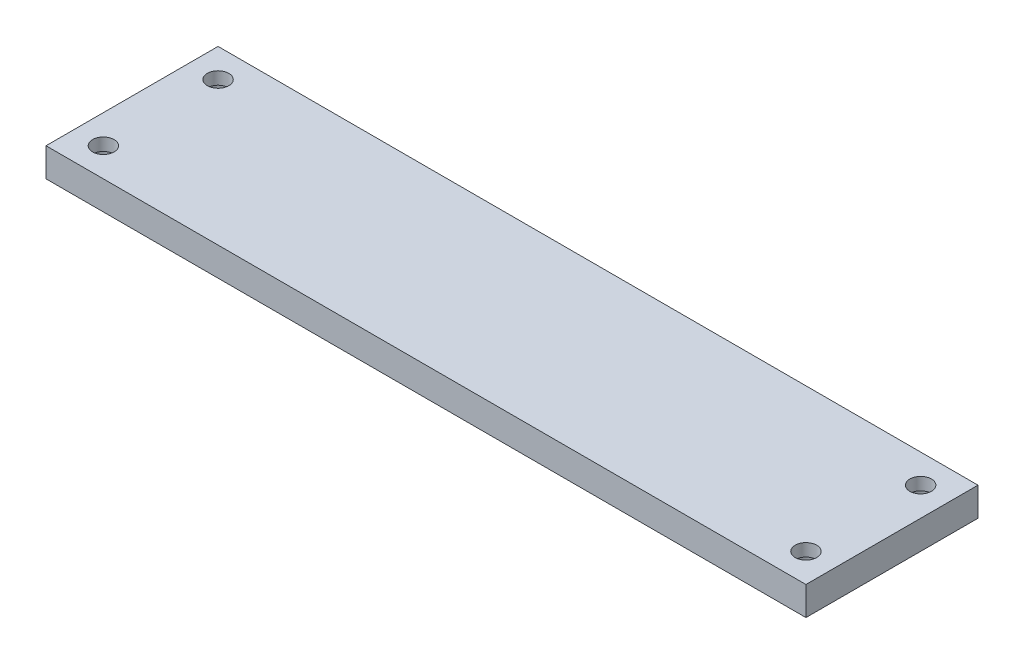
ISO-10303-21;
HEADER;
FILE_DESCRIPTION(('STEP AP214'),'2;1');
FILE_NAME('part.step','',(''),(''),'','','');
FILE_SCHEMA(('AUTOMOTIVE_DESIGN { 1 0 10303 214 1 1 1 1 }'));
ENDSEC;
DATA;
#1=APPLICATION_CONTEXT('core data for automotive mechanical design processes');
#2=APPLICATION_PROTOCOL_DEFINITION('international standard','automotive_design',2000,#1);
#3=PRODUCT_CONTEXT('',#1,'mechanical');
#4=PRODUCT('Part','Part','',(#3));
#5=PRODUCT_RELATED_PRODUCT_CATEGORY('part','',(#4));
#6=PRODUCT_DEFINITION_FORMATION('','',#4);
#7=PRODUCT_DEFINITION_CONTEXT('part definition',#1,'design');
#8=PRODUCT_DEFINITION('design','',#6,#7);
#9=PRODUCT_DEFINITION_SHAPE('','',#8);
#10=(LENGTH_UNIT() NAMED_UNIT(*) SI_UNIT(.MILLI.,.METRE.));
#11=(NAMED_UNIT(*) PLANE_ANGLE_UNIT() SI_UNIT($,.RADIAN.));
#12=(NAMED_UNIT(*) SI_UNIT($,.STERADIAN.) SOLID_ANGLE_UNIT());
#13=UNCERTAINTY_MEASURE_WITH_UNIT(LENGTH_MEASURE(1.E-05),#10,'distance_accuracy_value','');
#14=(GEOMETRIC_REPRESENTATION_CONTEXT(3) GLOBAL_UNCERTAINTY_ASSIGNED_CONTEXT((#13)) GLOBAL_UNIT_ASSIGNED_CONTEXT((#10,
#11,#12)) REPRESENTATION_CONTEXT('',''));
#15=CARTESIAN_POINT('',(0.,0.,0.));
#16=DIRECTION('',(0.,0.,1.));
#17=DIRECTION('',(1.,0.,0.));
#18=AXIS2_PLACEMENT_3D('',#15,#16,#17);
#19=CARTESIAN_POINT('',(0.,2.,0.));
#20=DIRECTION('',(0.,1.,0.));
#21=DIRECTION('',(0.,0.,1.));
#22=AXIS2_PLACEMENT_3D('',#19,#20,#21);
#23=PLANE('',#22);
#24=CARTESIAN_POINT('',(49.,2.,-8.));
#25=DIRECTION('',(0.,1.,0.));
#26=DIRECTION('',(0.,0.,1.));
#27=AXIS2_PLACEMENT_3D('',#24,#25,#26);
#28=CIRCLE('',#27,1.50000000000001);
#29=CARTESIAN_POINT('',(49.,2.,-6.49999999999999));
#30=VERTEX_POINT('',#29);
#31=EDGE_CURVE('E139',#30,#30,#28,.F.);
#32=ORIENTED_EDGE('',*,*,#31,.T.);
#33=EDGE_LOOP('',(#32));
#34=FACE_BOUND('',#33,.T.);
#35=CARTESIAN_POINT('',(49.,2.,8.));
#36=DIRECTION('',(0.,1.,0.));
#37=DIRECTION('',(0.,0.,1.));
#38=AXIS2_PLACEMENT_3D('',#35,#36,#37);
#39=CIRCLE('',#38,1.50000000000002);
#40=CARTESIAN_POINT('',(49.,2.,9.50000000000002));
#41=VERTEX_POINT('',#40);
#42=EDGE_CURVE('E142',#41,#41,#39,.T.);
#43=ORIENTED_EDGE('',*,*,#42,.F.);
#44=EDGE_LOOP('',(#43));
#45=FACE_BOUND('',#44,.T.);
#46=CARTESIAN_POINT('',(-49.,2.,-7.99999999999999));
#47=DIRECTION('',(0.,1.,0.));
#48=DIRECTION('',(0.,0.,1.));
#49=AXIS2_PLACEMENT_3D('',#46,#47,#48);
#50=CIRCLE('',#49,1.5);
#51=CARTESIAN_POINT('',(-49.,2.,-6.49999999999999));
#52=VERTEX_POINT('',#51);
#53=EDGE_CURVE('E11',#52,#52,#50,.T.);
#54=ORIENTED_EDGE('',*,*,#53,.F.);
#55=EDGE_LOOP('',(#54));
#56=FACE_BOUND('',#55,.T.);
#57=CARTESIAN_POINT('',(-49.,2.,8.00000000000001));
#58=DIRECTION('',(0.,1.,0.));
#59=DIRECTION('',(0.,0.,1.));
#60=AXIS2_PLACEMENT_3D('',#57,#58,#59);
#61=CIRCLE('',#60,1.5);
#62=CARTESIAN_POINT('',(-49.,2.,9.50000000000002));
#63=VERTEX_POINT('',#62);
#64=EDGE_CURVE('E41',#63,#63,#61,.F.);
#65=ORIENTED_EDGE('',*,*,#64,.T.);
#66=EDGE_LOOP('',(#65));
#67=FACE_BOUND('',#66,.T.);
#68=DIRECTION('',(-1.,0.,0.));
#69=VECTOR('',#68,1.);
#70=CARTESIAN_POINT('',(0.,2.,-12.));
#71=LINE('',#70,#69);
#72=CARTESIAN_POINT('',(53.,2.,-12.));
#73=VERTEX_POINT('',#72);
#74=CARTESIAN_POINT('',(-53.,2.,-12.));
#75=VERTEX_POINT('',#74);
#76=EDGE_CURVE('E100',#73,#75,#71,.T.);
#77=ORIENTED_EDGE('',*,*,#76,.T.);
#78=DIRECTION('',(0.,0.,1.));
#79=VECTOR('',#78,1.);
#80=CARTESIAN_POINT('',(-53.,2.,0.));
#81=LINE('',#80,#79);
#82=CARTESIAN_POINT('',(-53.,2.,12.));
#83=VERTEX_POINT('',#82);
#84=EDGE_CURVE('E109',#75,#83,#81,.T.);
#85=ORIENTED_EDGE('',*,*,#84,.T.);
#86=DIRECTION('',(1.,0.,0.));
#87=VECTOR('',#86,1.);
#88=CARTESIAN_POINT('',(0.,2.,12.));
#89=LINE('',#88,#87);
#90=CARTESIAN_POINT('',(53.,2.,12.));
#91=VERTEX_POINT('',#90);
#92=EDGE_CURVE('E107',#83,#91,#89,.T.);
#93=ORIENTED_EDGE('',*,*,#92,.T.);
#94=DIRECTION('',(0.,0.,-1.));
#95=VECTOR('',#94,1.);
#96=CARTESIAN_POINT('',(53.,2.,0.));
#97=LINE('',#96,#95);
#98=EDGE_CURVE('E78',#91,#73,#97,.T.);
#99=ORIENTED_EDGE('',*,*,#98,.T.);
#100=EDGE_LOOP('',(#77,#85,#93,#99));
#101=FACE_BOUND('',#100,.T.);
#102=ADVANCED_FACE('F33',(#34,#45,#56,#67,#101),#23,.T.);
#103=CARTESIAN_POINT('',(0.,-2.,0.));
#104=DIRECTION('',(0.,1.,0.));
#105=DIRECTION('',(0.,0.,1.));
#106=AXIS2_PLACEMENT_3D('',#103,#104,#105);
#107=PLANE('',#106);
#108=CARTESIAN_POINT('',(-49.,-2.,-7.99999999999999));
#109=DIRECTION('',(0.,-1.,0.));
#110=DIRECTION('',(0.,0.,-1.));
#111=AXIS2_PLACEMENT_3D('',#108,#109,#110);
#112=CIRCLE('',#111,2.5);
#113=CARTESIAN_POINT('',(-49.,-2.,-10.5));
#114=VERTEX_POINT('',#113);
#115=EDGE_CURVE('E136',#114,#114,#112,.T.);
#116=ORIENTED_EDGE('',*,*,#115,.F.);
#117=EDGE_LOOP('',(#116));
#118=FACE_BOUND('',#117,.T.);
#119=CARTESIAN_POINT('',(-49.,-2.,8.00000000000001));
#120=DIRECTION('',(0.,-1.,0.));
#121=DIRECTION('',(0.,0.,-1.));
#122=AXIS2_PLACEMENT_3D('',#119,#120,#121);
#123=CIRCLE('',#122,2.5);
#124=CARTESIAN_POINT('',(-49.,-2.,5.50000000000001));
#125=VERTEX_POINT('',#124);
#126=EDGE_CURVE('E129',#125,#125,#123,.T.);
#127=ORIENTED_EDGE('',*,*,#126,.F.);
#128=EDGE_LOOP('',(#127));
#129=FACE_BOUND('',#128,.T.);
#130=CARTESIAN_POINT('',(49.,-2.,-8.));
#131=DIRECTION('',(0.,-1.,0.));
#132=DIRECTION('',(0.,0.,-1.));
#133=AXIS2_PLACEMENT_3D('',#130,#131,#132);
#134=CIRCLE('',#133,2.5);
#135=CARTESIAN_POINT('',(49.,-2.,-10.5));
#136=VERTEX_POINT('',#135);
#137=EDGE_CURVE('E122',#136,#136,#134,.T.);
#138=ORIENTED_EDGE('',*,*,#137,.F.);
#139=EDGE_LOOP('',(#138));
#140=FACE_BOUND('',#139,.T.);
#141=CARTESIAN_POINT('',(49.,-2.,8.));
#142=DIRECTION('',(0.,-1.,0.));
#143=DIRECTION('',(0.,0.,-1.));
#144=AXIS2_PLACEMENT_3D('',#141,#142,#143);
#145=CIRCLE('',#144,2.5);
#146=CARTESIAN_POINT('',(49.,-2.,5.5));
#147=VERTEX_POINT('',#146);
#148=EDGE_CURVE('E112',#147,#147,#145,.T.);
#149=ORIENTED_EDGE('',*,*,#148,.F.);
#150=EDGE_LOOP('',(#149));
#151=FACE_BOUND('',#150,.T.);
#152=DIRECTION('',(0.,0.,-1.));
#153=VECTOR('',#152,1.);
#154=CARTESIAN_POINT('',(-53.,-2.,12.));
#155=LINE('',#154,#153);
#156=CARTESIAN_POINT('',(-53.,-2.,12.));
#157=VERTEX_POINT('',#156);
#158=CARTESIAN_POINT('',(-53.,-2.,-12.));
#159=VERTEX_POINT('',#158);
#160=EDGE_CURVE('E96',#157,#159,#155,.T.);
#161=ORIENTED_EDGE('',*,*,#160,.T.);
#162=DIRECTION('',(1.,0.,0.));
#163=VECTOR('',#162,1.);
#164=CARTESIAN_POINT('',(53.,-2.,-12.));
#165=LINE('',#164,#163);
#166=CARTESIAN_POINT('',(53.,-2.,-12.));
#167=VERTEX_POINT('',#166);
#168=EDGE_CURVE('E94',#159,#167,#165,.T.);
#169=ORIENTED_EDGE('',*,*,#168,.T.);
#170=DIRECTION('',(0.,0.,1.));
#171=VECTOR('',#170,1.);
#172=CARTESIAN_POINT('',(53.,-2.,12.));
#173=LINE('',#172,#171);
#174=CARTESIAN_POINT('',(53.,-2.,12.));
#175=VERTEX_POINT('',#174);
#176=EDGE_CURVE('E57',#167,#175,#173,.T.);
#177=ORIENTED_EDGE('',*,*,#176,.T.);
#178=DIRECTION('',(-1.,0.,0.));
#179=VECTOR('',#178,1.);
#180=CARTESIAN_POINT('',(53.,-2.,12.));
#181=LINE('',#180,#179);
#182=EDGE_CURVE('E85',#175,#157,#181,.T.);
#183=ORIENTED_EDGE('',*,*,#182,.T.);
#184=EDGE_LOOP('',(#161,#169,#177,#183));
#185=FACE_BOUND('',#184,.T.);
#186=ADVANCED_FACE('F93',(#118,#129,#140,#151,#185),#107,.F.);
#187=CARTESIAN_POINT('',(49.,-8.,8.));
#188=DIRECTION('',(0.,1.,0.));
#189=DIRECTION('',(0.,0.,1.));
#190=AXIS2_PLACEMENT_3D('',#187,#188,#189);
#191=CYLINDRICAL_SURFACE('',#190,1.50000000000002);
#192=ORIENTED_EDGE('',*,*,#42,.T.);
#193=EDGE_LOOP('',(#192));
#194=FACE_BOUND('',#193,.T.);
#195=CARTESIAN_POINT('',(49.,0.25,8.));
#196=DIRECTION('',(0.,-1.,0.));
#197=DIRECTION('',(0.,0.,-1.));
#198=AXIS2_PLACEMENT_3D('',#195,#196,#197);
#199=CIRCLE('',#198,1.50000000000002);
#200=CARTESIAN_POINT('',(49.,0.25,6.49999999999998));
#201=VERTEX_POINT('',#200);
#202=EDGE_CURVE('E36',#201,#201,#199,.F.);
#203=ORIENTED_EDGE('',*,*,#202,.F.);
#204=EDGE_LOOP('',(#203));
#205=FACE_BOUND('',#204,.T.);
#206=ADVANCED_FACE('F171',(#194,#205),#191,.F.);
#207=CARTESIAN_POINT('',(49.,-8.,-8.));
#208=DIRECTION('',(0.,1.,0.));
#209=DIRECTION('',(0.,0.,1.));
#210=AXIS2_PLACEMENT_3D('',#207,#208,#209);
#211=CYLINDRICAL_SURFACE('',#210,1.50000000000001);
#212=ORIENTED_EDGE('',*,*,#31,.F.);
#213=EDGE_LOOP('',(#212));
#214=FACE_BOUND('',#213,.T.);
#215=CARTESIAN_POINT('',(49.,0.25,-8.));
#216=DIRECTION('',(0.,-1.,0.));
#217=DIRECTION('',(0.,0.,-1.));
#218=AXIS2_PLACEMENT_3D('',#215,#216,#217);
#219=CIRCLE('',#218,1.50000000000001);
#220=CARTESIAN_POINT('',(49.,0.25,-9.50000000000001));
#221=VERTEX_POINT('',#220);
#222=EDGE_CURVE('E121',#221,#221,#219,.T.);
#223=ORIENTED_EDGE('',*,*,#222,.T.);
#224=EDGE_LOOP('',(#223));
#225=FACE_BOUND('',#224,.T.);
#226=ADVANCED_FACE('F153',(#214,#225),#211,.F.);
#227=CARTESIAN_POINT('',(-49.,-8.,8.00000000000001));
#228=DIRECTION('',(0.,1.,0.));
#229=DIRECTION('',(0.,0.,1.));
#230=AXIS2_PLACEMENT_3D('',#227,#228,#229);
#231=CYLINDRICAL_SURFACE('',#230,1.5);
#232=ORIENTED_EDGE('',*,*,#64,.F.);
#233=EDGE_LOOP('',(#232));
#234=FACE_BOUND('',#233,.T.);
#235=CARTESIAN_POINT('',(-49.,0.25,8.00000000000001));
#236=DIRECTION('',(0.,-1.,0.));
#237=DIRECTION('',(0.,0.,-1.));
#238=AXIS2_PLACEMENT_3D('',#235,#236,#237);
#239=CIRCLE('',#238,1.5);
#240=CARTESIAN_POINT('',(-49.,0.25,6.50000000000001));
#241=VERTEX_POINT('',#240);
#242=EDGE_CURVE('E128',#241,#241,#239,.T.);
#243=ORIENTED_EDGE('',*,*,#242,.T.);
#244=EDGE_LOOP('',(#243));
#245=FACE_BOUND('',#244,.T.);
#246=ADVANCED_FACE('F315',(#234,#245),#231,.F.);
#247=CARTESIAN_POINT('',(-49.,-8.,-7.99999999999999));
#248=DIRECTION('',(0.,1.,0.));
#249=DIRECTION('',(0.,0.,1.));
#250=AXIS2_PLACEMENT_3D('',#247,#248,#249);
#251=CYLINDRICAL_SURFACE('',#250,1.5);
#252=ORIENTED_EDGE('',*,*,#53,.T.);
#253=EDGE_LOOP('',(#252));
#254=FACE_BOUND('',#253,.T.);
#255=CARTESIAN_POINT('',(-49.,0.25,-7.99999999999999));
#256=DIRECTION('',(0.,-1.,0.));
#257=DIRECTION('',(0.,0.,-1.));
#258=AXIS2_PLACEMENT_3D('',#255,#256,#257);
#259=CIRCLE('',#258,1.5);
#260=CARTESIAN_POINT('',(-49.,0.25,-9.5));
#261=VERTEX_POINT('',#260);
#262=EDGE_CURVE('E135',#261,#261,#259,.F.);
#263=ORIENTED_EDGE('',*,*,#262,.F.);
#264=EDGE_LOOP('',(#263));
#265=FACE_BOUND('',#264,.T.);
#266=ADVANCED_FACE('F294',(#254,#265),#251,.F.);
#267=CARTESIAN_POINT('',(-49.,0.25,-7.99999999999999));
#268=DIRECTION('',(0.,-1.,0.));
#269=DIRECTION('',(0.,0.,-1.));
#270=AXIS2_PLACEMENT_3D('',#267,#268,#269);
#271=PLANE('',#270);
#272=CARTESIAN_POINT('',(-49.,0.25,-7.99999999999999));
#273=DIRECTION('',(0.,-1.,0.));
#274=DIRECTION('',(0.,0.,-1.));
#275=AXIS2_PLACEMENT_3D('',#272,#273,#274);
#276=CIRCLE('',#275,2.5);
#277=CARTESIAN_POINT('',(-49.,0.25,-10.5));
#278=VERTEX_POINT('',#277);
#279=EDGE_CURVE('E132',#278,#278,#276,.T.);
#280=ORIENTED_EDGE('',*,*,#279,.T.);
#281=EDGE_LOOP('',(#280));
#282=FACE_BOUND('',#281,.T.);
#283=ORIENTED_EDGE('',*,*,#262,.T.);
#284=EDGE_LOOP('',(#283));
#285=FACE_BOUND('',#284,.T.);
#286=ADVANCED_FACE('F285',(#282,#285),#271,.T.);
#287=CARTESIAN_POINT('',(-49.,0.25,-7.99999999999999));
#288=DIRECTION('',(0.,-1.,0.));
#289=DIRECTION('',(0.,0.,-1.));
#290=AXIS2_PLACEMENT_3D('',#287,#288,#289);
#291=CYLINDRICAL_SURFACE('',#290,2.5);
#292=ORIENTED_EDGE('',*,*,#279,.F.);
#293=EDGE_LOOP('',(#292));
#294=FACE_BOUND('',#293,.T.);
#295=ORIENTED_EDGE('',*,*,#115,.T.);
#296=EDGE_LOOP('',(#295));
#297=FACE_BOUND('',#296,.T.);
#298=ADVANCED_FACE('F276',(#294,#297),#291,.F.);
#299=CARTESIAN_POINT('',(-49.,0.25,8.00000000000001));
#300=DIRECTION('',(0.,-1.,0.));
#301=DIRECTION('',(0.,0.,-1.));
#302=AXIS2_PLACEMENT_3D('',#299,#300,#301);
#303=CYLINDRICAL_SURFACE('',#302,2.5);
#304=CARTESIAN_POINT('',(-49.,0.25,8.00000000000001));
#305=DIRECTION('',(0.,-1.,0.));
#306=DIRECTION('',(0.,0.,-1.));
#307=AXIS2_PLACEMENT_3D('',#304,#305,#306);
#308=CIRCLE('',#307,2.5);
#309=CARTESIAN_POINT('',(-49.,0.25,5.50000000000001));
#310=VERTEX_POINT('',#309);
#311=EDGE_CURVE('E125',#310,#310,#308,.T.);
#312=ORIENTED_EDGE('',*,*,#311,.F.);
#313=EDGE_LOOP('',(#312));
#314=FACE_BOUND('',#313,.T.);
#315=ORIENTED_EDGE('',*,*,#126,.T.);
#316=EDGE_LOOP('',(#315));
#317=FACE_BOUND('',#316,.T.);
#318=ADVANCED_FACE('F267',(#314,#317),#303,.F.);
#319=CARTESIAN_POINT('',(-49.,0.25,8.00000000000001));
#320=DIRECTION('',(0.,-1.,0.));
#321=DIRECTION('',(0.,0.,-1.));
#322=AXIS2_PLACEMENT_3D('',#319,#320,#321);
#323=PLANE('',#322);
#324=ORIENTED_EDGE('',*,*,#242,.F.);
#325=EDGE_LOOP('',(#324));
#326=FACE_BOUND('',#325,.T.);
#327=ORIENTED_EDGE('',*,*,#311,.T.);
#328=EDGE_LOOP('',(#327));
#329=FACE_BOUND('',#328,.T.);
#330=ADVANCED_FACE('F165',(#326,#329),#323,.T.);
#331=CARTESIAN_POINT('',(49.,0.25,-8.));
#332=DIRECTION('',(0.,-1.,0.));
#333=DIRECTION('',(0.,0.,-1.));
#334=AXIS2_PLACEMENT_3D('',#331,#332,#333);
#335=CYLINDRICAL_SURFACE('',#334,2.5);
#336=CARTESIAN_POINT('',(49.,0.25,-8.));
#337=DIRECTION('',(0.,-1.,0.));
#338=DIRECTION('',(0.,0.,-1.));
#339=AXIS2_PLACEMENT_3D('',#336,#337,#338);
#340=CIRCLE('',#339,2.5);
#341=CARTESIAN_POINT('',(49.,0.25,-10.5));
#342=VERTEX_POINT('',#341);
#343=EDGE_CURVE('E118',#342,#342,#340,.T.);
#344=ORIENTED_EDGE('',*,*,#343,.F.);
#345=EDGE_LOOP('',(#344));
#346=FACE_BOUND('',#345,.T.);
#347=ORIENTED_EDGE('',*,*,#137,.T.);
#348=EDGE_LOOP('',(#347));
#349=FACE_BOUND('',#348,.T.);
#350=ADVANCED_FACE('F159',(#346,#349),#335,.F.);
#351=CARTESIAN_POINT('',(49.,0.25,-8.));
#352=DIRECTION('',(0.,-1.,0.));
#353=DIRECTION('',(0.,0.,-1.));
#354=AXIS2_PLACEMENT_3D('',#351,#352,#353);
#355=PLANE('',#354);
#356=ORIENTED_EDGE('',*,*,#222,.F.);
#357=EDGE_LOOP('',(#356));
#358=FACE_BOUND('',#357,.T.);
#359=ORIENTED_EDGE('',*,*,#343,.T.);
#360=EDGE_LOOP('',(#359));
#361=FACE_BOUND('',#360,.T.);
#362=ADVANCED_FACE('F155',(#358,#361),#355,.T.);
#363=CARTESIAN_POINT('',(49.,0.25,8.));
#364=DIRECTION('',(0.,-1.,0.));
#365=DIRECTION('',(0.,0.,-1.));
#366=AXIS2_PLACEMENT_3D('',#363,#364,#365);
#367=PLANE('',#366);
#368=CARTESIAN_POINT('',(49.,0.25,8.));
#369=DIRECTION('',(0.,-1.,0.));
#370=DIRECTION('',(0.,0.,-1.));
#371=AXIS2_PLACEMENT_3D('',#368,#369,#370);
#372=CIRCLE('',#371,2.5);
#373=CARTESIAN_POINT('',(49.,0.25,5.5));
#374=VERTEX_POINT('',#373);
#375=EDGE_CURVE('E113',#374,#374,#372,.T.);
#376=ORIENTED_EDGE('',*,*,#375,.T.);
#377=EDGE_LOOP('',(#376));
#378=FACE_BOUND('',#377,.T.);
#379=ORIENTED_EDGE('',*,*,#202,.T.);
#380=EDGE_LOOP('',(#379));
#381=FACE_BOUND('',#380,.T.);
#382=ADVANCED_FACE('F158',(#378,#381),#367,.T.);
#383=CARTESIAN_POINT('',(49.,0.25,8.));
#384=DIRECTION('',(0.,-1.,0.));
#385=DIRECTION('',(0.,0.,-1.));
#386=AXIS2_PLACEMENT_3D('',#383,#384,#385);
#387=CYLINDRICAL_SURFACE('',#386,2.5);
#388=ORIENTED_EDGE('',*,*,#375,.F.);
#389=EDGE_LOOP('',(#388));
#390=FACE_BOUND('',#389,.T.);
#391=ORIENTED_EDGE('',*,*,#148,.T.);
#392=EDGE_LOOP('',(#391));
#393=FACE_BOUND('',#392,.T.);
#394=ADVANCED_FACE('F176',(#390,#393),#387,.F.);
#395=CARTESIAN_POINT('',(-53.,17.,12.));
#396=DIRECTION('',(-1.,0.,0.));
#397=DIRECTION('',(0.,0.,1.));
#398=AXIS2_PLACEMENT_3D('',#395,#396,#397);
#399=PLANE('',#398);
#400=DIRECTION('',(0.,-1.,0.));
#401=VECTOR('',#400,1.);
#402=CARTESIAN_POINT('',(-53.,17.,-12.));
#403=LINE('',#402,#401);
#404=EDGE_CURVE('E49',#75,#159,#403,.T.);
#405=ORIENTED_EDGE('',*,*,#404,.T.);
#406=ORIENTED_EDGE('',*,*,#160,.F.);
#407=DIRECTION('',(0.,-1.,0.));
#408=VECTOR('',#407,1.);
#409=CARTESIAN_POINT('',(-53.,17.,12.));
#410=LINE('',#409,#408);
#411=EDGE_CURVE('E81',#83,#157,#410,.T.);
#412=ORIENTED_EDGE('',*,*,#411,.F.);
#413=ORIENTED_EDGE('',*,*,#84,.F.);
#414=EDGE_LOOP('',(#405,#406,#412,#413));
#415=FACE_BOUND('',#414,.T.);
#416=ADVANCED_FACE('F178',(#415),#399,.T.);
#417=CARTESIAN_POINT('',(53.,17.,12.));
#418=DIRECTION('',(0.,0.,1.));
#419=DIRECTION('',(1.,0.,0.));
#420=AXIS2_PLACEMENT_3D('',#417,#418,#419);
#421=PLANE('',#420);
#422=ORIENTED_EDGE('',*,*,#411,.T.);
#423=ORIENTED_EDGE('',*,*,#182,.F.);
#424=DIRECTION('',(0.,-1.,0.));
#425=VECTOR('',#424,1.);
#426=CARTESIAN_POINT('',(53.,17.,12.));
#427=LINE('',#426,#425);
#428=EDGE_CURVE('E74',#91,#175,#427,.T.);
#429=ORIENTED_EDGE('',*,*,#428,.F.);
#430=ORIENTED_EDGE('',*,*,#92,.F.);
#431=EDGE_LOOP('',(#422,#423,#429,#430));
#432=FACE_BOUND('',#431,.T.);
#433=ADVANCED_FACE('F86',(#432),#421,.T.);
#434=CARTESIAN_POINT('',(53.,17.,12.));
#435=DIRECTION('',(1.,0.,0.));
#436=DIRECTION('',(0.,0.,-1.));
#437=AXIS2_PLACEMENT_3D('',#434,#435,#436);
#438=PLANE('',#437);
#439=ORIENTED_EDGE('',*,*,#428,.T.);
#440=ORIENTED_EDGE('',*,*,#176,.F.);
#441=DIRECTION('',(0.,-1.,0.));
#442=VECTOR('',#441,1.);
#443=CARTESIAN_POINT('',(53.,17.,-12.));
#444=LINE('',#443,#442);
#445=EDGE_CURVE('E82',#73,#167,#444,.T.);
#446=ORIENTED_EDGE('',*,*,#445,.F.);
#447=ORIENTED_EDGE('',*,*,#98,.F.);
#448=EDGE_LOOP('',(#439,#440,#446,#447));
#449=FACE_BOUND('',#448,.T.);
#450=ADVANCED_FACE('F76',(#449),#438,.T.);
#451=CARTESIAN_POINT('',(53.,17.,-12.));
#452=DIRECTION('',(0.,0.,-1.));
#453=DIRECTION('',(-1.,0.,0.));
#454=AXIS2_PLACEMENT_3D('',#451,#452,#453);
#455=PLANE('',#454);
#456=ORIENTED_EDGE('',*,*,#445,.T.);
#457=ORIENTED_EDGE('',*,*,#168,.F.);
#458=ORIENTED_EDGE('',*,*,#404,.F.);
#459=ORIENTED_EDGE('',*,*,#76,.F.);
#460=EDGE_LOOP('',(#456,#457,#458,#459));
#461=FACE_BOUND('',#460,.T.);
#462=ADVANCED_FACE('F202',(#461),#455,.T.);
#463=CLOSED_SHELL('',(#102,#186,#206,#226,#246,#266,#286,#298,#318,#330,#350,#362,#382,#394,
#416,#433,#450,#462));
#464=MANIFOLD_SOLID_BREP('B2',#463);
#465=ADVANCED_BREP_SHAPE_REPRESENTATION('',(#18,#464),#14);
#466=SHAPE_DEFINITION_REPRESENTATION(#9,#465);
ENDSEC;
END-ISO-10303-21;
